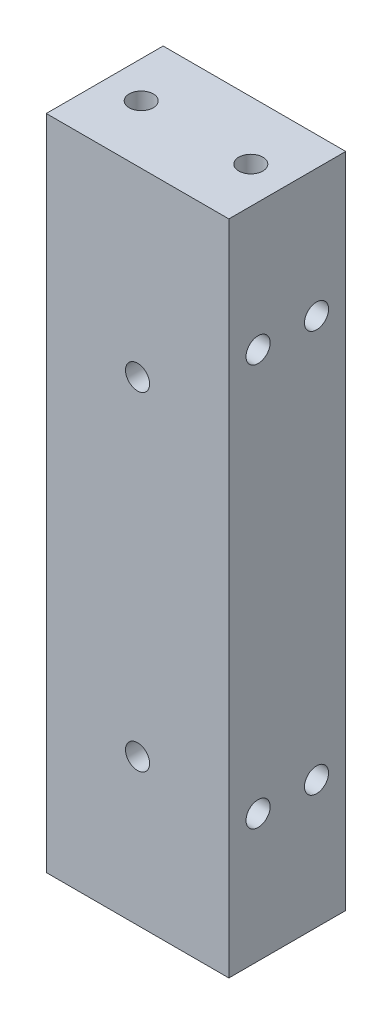
ISO-10303-21;
HEADER;
FILE_DESCRIPTION(('STEP AP214'),'2;1');
FILE_NAME('part.step','',(''),(''),'','','');
FILE_SCHEMA(('AUTOMOTIVE_DESIGN { 1 0 10303 214 1 1 1 1 }'));
ENDSEC;
DATA;
#1=APPLICATION_CONTEXT('core data for automotive mechanical design processes');
#2=APPLICATION_PROTOCOL_DEFINITION('international standard','automotive_design',2000,#1);
#3=PRODUCT_CONTEXT('',#1,'mechanical');
#4=PRODUCT('Part','Part','',(#3));
#5=PRODUCT_RELATED_PRODUCT_CATEGORY('part','',(#4));
#6=PRODUCT_DEFINITION_FORMATION('','',#4);
#7=PRODUCT_DEFINITION_CONTEXT('part definition',#1,'design');
#8=PRODUCT_DEFINITION('design','',#6,#7);
#9=PRODUCT_DEFINITION_SHAPE('','',#8);
#10=(LENGTH_UNIT() NAMED_UNIT(*) SI_UNIT(.MILLI.,.METRE.));
#11=(NAMED_UNIT(*) PLANE_ANGLE_UNIT() SI_UNIT($,.RADIAN.));
#12=(NAMED_UNIT(*) SI_UNIT($,.STERADIAN.) SOLID_ANGLE_UNIT());
#13=UNCERTAINTY_MEASURE_WITH_UNIT(LENGTH_MEASURE(1.E-05),#10,'distance_accuracy_value','');
#14=(GEOMETRIC_REPRESENTATION_CONTEXT(3) GLOBAL_UNCERTAINTY_ASSIGNED_CONTEXT((#13)) GLOBAL_UNIT_ASSIGNED_CONTEXT((#10,
#11,#12)) REPRESENTATION_CONTEXT('',''));
#15=CARTESIAN_POINT('',(0.,0.,0.));
#16=DIRECTION('',(0.,0.,1.));
#17=DIRECTION('',(1.,0.,0.));
#18=AXIS2_PLACEMENT_3D('',#15,#16,#17);
#19=CARTESIAN_POINT('',(12.5,90.,8.));
#20=DIRECTION('',(-1.,0.,0.));
#21=DIRECTION('',(0.,0.,1.));
#22=AXIS2_PLACEMENT_3D('',#19,#20,#21);
#23=PLANE('',#22);
#24=CARTESIAN_POINT('',(12.5,72.5,-4.));
#25=DIRECTION('',(1.,0.,0.));
#26=DIRECTION('',(0.,0.,-1.));
#27=AXIS2_PLACEMENT_3D('',#24,#25,#26);
#28=CIRCLE('',#27,1.64999999999998);
#29=CARTESIAN_POINT('',(12.5,72.5,-5.64999999999999));
#30=VERTEX_POINT('',#29);
#31=EDGE_CURVE('E142',#30,#30,#28,.T.);
#32=ORIENTED_EDGE('',*,*,#31,.F.);
#33=EDGE_LOOP('',(#32));
#34=FACE_BOUND('',#33,.T.);
#35=CARTESIAN_POINT('',(12.5,72.5,4.));
#36=DIRECTION('',(1.,0.,0.));
#37=DIRECTION('',(0.,0.,-1.));
#38=AXIS2_PLACEMENT_3D('',#35,#36,#37);
#39=CIRCLE('',#38,1.64999999999998);
#40=CARTESIAN_POINT('',(12.5,72.5,2.35000000000001));
#41=VERTEX_POINT('',#40);
#42=EDGE_CURVE('E141',#41,#41,#39,.T.);
#43=ORIENTED_EDGE('',*,*,#42,.F.);
#44=EDGE_LOOP('',(#43));
#45=FACE_BOUND('',#44,.T.);
#46=CARTESIAN_POINT('',(12.5,17.5,-4.));
#47=DIRECTION('',(1.,0.,0.));
#48=DIRECTION('',(0.,0.,-1.));
#49=AXIS2_PLACEMENT_3D('',#46,#47,#48);
#50=CIRCLE('',#49,1.64999999999999);
#51=CARTESIAN_POINT('',(12.5,17.5,-5.65));
#52=VERTEX_POINT('',#51);
#53=EDGE_CURVE('E155',#52,#52,#50,.T.);
#54=ORIENTED_EDGE('',*,*,#53,.F.);
#55=EDGE_LOOP('',(#54));
#56=FACE_BOUND('',#55,.T.);
#57=CARTESIAN_POINT('',(12.5,17.5,4.));
#58=DIRECTION('',(1.,0.,0.));
#59=DIRECTION('',(0.,0.,-1.));
#60=AXIS2_PLACEMENT_3D('',#57,#58,#59);
#61=CIRCLE('',#60,1.64999999999999);
#62=CARTESIAN_POINT('',(12.5,17.5,2.35));
#63=VERTEX_POINT('',#62);
#64=EDGE_CURVE('E163',#63,#63,#61,.T.);
#65=ORIENTED_EDGE('',*,*,#64,.F.);
#66=EDGE_LOOP('',(#65));
#67=FACE_BOUND('',#66,.T.);
#68=DIRECTION('',(0.,0.,-1.));
#69=VECTOR('',#68,1.);
#70=CARTESIAN_POINT('',(12.5,0.,8.));
#71=LINE('',#70,#69);
#72=CARTESIAN_POINT('',(12.5,0.,8.));
#73=VERTEX_POINT('',#72);
#74=CARTESIAN_POINT('',(12.5,0.,-8.));
#75=VERTEX_POINT('',#74);
#76=EDGE_CURVE('E251',#73,#75,#71,.T.);
#77=ORIENTED_EDGE('',*,*,#76,.T.);
#78=DIRECTION('',(0.,-1.,0.));
#79=VECTOR('',#78,1.);
#80=CARTESIAN_POINT('',(12.5,90.,-8.));
#81=LINE('',#80,#79);
#82=CARTESIAN_POINT('',(12.5,90.,-8.));
#83=VERTEX_POINT('',#82);
#84=EDGE_CURVE('E11',#83,#75,#81,.T.);
#85=ORIENTED_EDGE('',*,*,#84,.F.);
#86=DIRECTION('',(0.,0.,-1.));
#87=VECTOR('',#86,1.);
#88=CARTESIAN_POINT('',(12.5,90.,8.));
#89=LINE('',#88,#87);
#90=CARTESIAN_POINT('',(12.5,90.,8.));
#91=VERTEX_POINT('',#90);
#92=EDGE_CURVE('E252',#91,#83,#89,.T.);
#93=ORIENTED_EDGE('',*,*,#92,.F.);
#94=DIRECTION('',(0.,-1.,0.));
#95=VECTOR('',#94,1.);
#96=CARTESIAN_POINT('',(12.5,90.,8.));
#97=LINE('',#96,#95);
#98=EDGE_CURVE('E262',#91,#73,#97,.T.);
#99=ORIENTED_EDGE('',*,*,#98,.T.);
#100=EDGE_LOOP('',(#77,#85,#93,#99));
#101=FACE_BOUND('',#100,.T.);
#102=ADVANCED_FACE('F45',(#34,#45,#56,#67,#101),#23,.F.);
#103=CARTESIAN_POINT('',(-12.5,90.,-8.));
#104=DIRECTION('',(0.,0.,1.));
#105=DIRECTION('',(1.,0.,0.));
#106=AXIS2_PLACEMENT_3D('',#103,#104,#105);
#107=PLANE('',#106);
#108=CARTESIAN_POINT('',(0.,20.,-8.));
#109=DIRECTION('',(0.,0.,-1.));
#110=DIRECTION('',(-1.,0.,0.));
#111=AXIS2_PLACEMENT_3D('',#108,#109,#110);
#112=CIRCLE('',#111,1.64999999999999);
#113=CARTESIAN_POINT('',(-1.64999999999999,20.,-8.));
#114=VERTEX_POINT('',#113);
#115=EDGE_CURVE('E203',#114,#114,#112,.T.);
#116=ORIENTED_EDGE('',*,*,#115,.F.);
#117=EDGE_LOOP('',(#116));
#118=FACE_BOUND('',#117,.T.);
#119=CARTESIAN_POINT('',(1.54390389361936E-13,65.,-8.));
#120=DIRECTION('',(0.,0.,-1.));
#121=DIRECTION('',(-1.,0.,0.));
#122=AXIS2_PLACEMENT_3D('',#119,#120,#121);
#123=CIRCLE('',#122,1.64999999999999);
#124=CARTESIAN_POINT('',(-1.64999999999983,65.,-8.));
#125=VERTEX_POINT('',#124);
#126=EDGE_CURVE('E211',#125,#125,#123,.T.);
#127=ORIENTED_EDGE('',*,*,#126,.F.);
#128=EDGE_LOOP('',(#127));
#129=FACE_BOUND('',#128,.T.);
#130=DIRECTION('',(-1.,0.,0.));
#131=VECTOR('',#130,1.);
#132=CARTESIAN_POINT('',(-12.5,0.,-8.));
#133=LINE('',#132,#131);
#134=CARTESIAN_POINT('',(-12.5,0.,-8.));
#135=VERTEX_POINT('',#134);
#136=EDGE_CURVE('E266',#75,#135,#133,.T.);
#137=ORIENTED_EDGE('',*,*,#136,.T.);
#138=DIRECTION('',(0.,-1.,0.));
#139=VECTOR('',#138,1.);
#140=CARTESIAN_POINT('',(-12.5,90.,-8.));
#141=LINE('',#140,#139);
#142=CARTESIAN_POINT('',(-12.5,90.,-8.));
#143=VERTEX_POINT('',#142);
#144=EDGE_CURVE('E54',#143,#135,#141,.T.);
#145=ORIENTED_EDGE('',*,*,#144,.F.);
#146=DIRECTION('',(-1.,0.,0.));
#147=VECTOR('',#146,1.);
#148=CARTESIAN_POINT('',(-12.5,90.,-8.));
#149=LINE('',#148,#147);
#150=EDGE_CURVE('E93',#83,#143,#149,.T.);
#151=ORIENTED_EDGE('',*,*,#150,.F.);
#152=ORIENTED_EDGE('',*,*,#84,.T.);
#153=EDGE_LOOP('',(#137,#145,#151,#152));
#154=FACE_BOUND('',#153,.T.);
#155=ADVANCED_FACE('F297',(#118,#129,#154),#107,.F.);
#156=CARTESIAN_POINT('',(-12.5,90.,8.));
#157=DIRECTION('',(1.,0.,0.));
#158=DIRECTION('',(0.,0.,-1.));
#159=AXIS2_PLACEMENT_3D('',#156,#157,#158);
#160=PLANE('',#159);
#161=CARTESIAN_POINT('',(-12.5,72.5,-4.));
#162=DIRECTION('',(-1.,0.,0.));
#163=DIRECTION('',(0.,0.,1.));
#164=AXIS2_PLACEMENT_3D('',#161,#162,#163);
#165=CIRCLE('',#164,1.64999999999998);
#166=CARTESIAN_POINT('',(-12.5,72.5,-2.35000000000002));
#167=VERTEX_POINT('',#166);
#168=EDGE_CURVE('E171',#167,#167,#165,.T.);
#169=ORIENTED_EDGE('',*,*,#168,.F.);
#170=EDGE_LOOP('',(#169));
#171=FACE_BOUND('',#170,.T.);
#172=CARTESIAN_POINT('',(-12.5,72.5,4.));
#173=DIRECTION('',(-1.,0.,0.));
#174=DIRECTION('',(0.,0.,1.));
#175=AXIS2_PLACEMENT_3D('',#172,#173,#174);
#176=CIRCLE('',#175,1.64999999999998);
#177=CARTESIAN_POINT('',(-12.5,72.5,5.64999999999998));
#178=VERTEX_POINT('',#177);
#179=EDGE_CURVE('E179',#178,#178,#176,.T.);
#180=ORIENTED_EDGE('',*,*,#179,.F.);
#181=EDGE_LOOP('',(#180));
#182=FACE_BOUND('',#181,.T.);
#183=CARTESIAN_POINT('',(-12.5,17.5,-4.));
#184=DIRECTION('',(-1.,0.,0.));
#185=DIRECTION('',(0.,0.,1.));
#186=AXIS2_PLACEMENT_3D('',#183,#184,#185);
#187=CIRCLE('',#186,1.64999999999999);
#188=CARTESIAN_POINT('',(-12.5,17.5,-2.35000000000001));
#189=VERTEX_POINT('',#188);
#190=EDGE_CURVE('E187',#189,#189,#187,.T.);
#191=ORIENTED_EDGE('',*,*,#190,.F.);
#192=EDGE_LOOP('',(#191));
#193=FACE_BOUND('',#192,.T.);
#194=CARTESIAN_POINT('',(-12.5,17.5,4.));
#195=DIRECTION('',(-1.,0.,0.));
#196=DIRECTION('',(0.,0.,1.));
#197=AXIS2_PLACEMENT_3D('',#194,#195,#196);
#198=CIRCLE('',#197,1.64999999999999);
#199=CARTESIAN_POINT('',(-12.5,17.5,5.64999999999999));
#200=VERTEX_POINT('',#199);
#201=EDGE_CURVE('E195',#200,#200,#198,.T.);
#202=ORIENTED_EDGE('',*,*,#201,.F.);
#203=EDGE_LOOP('',(#202));
#204=FACE_BOUND('',#203,.T.);
#205=DIRECTION('',(0.,0.,1.));
#206=VECTOR('',#205,1.);
#207=CARTESIAN_POINT('',(-12.5,0.,8.));
#208=LINE('',#207,#206);
#209=CARTESIAN_POINT('',(-12.5,0.,8.));
#210=VERTEX_POINT('',#209);
#211=EDGE_CURVE('E80',#135,#210,#208,.T.);
#212=ORIENTED_EDGE('',*,*,#211,.T.);
#213=DIRECTION('',(0.,-1.,0.));
#214=VECTOR('',#213,1.);
#215=CARTESIAN_POINT('',(-12.5,90.,8.));
#216=LINE('',#215,#214);
#217=CARTESIAN_POINT('',(-12.5,90.,8.));
#218=VERTEX_POINT('',#217);
#219=EDGE_CURVE('E275',#218,#210,#216,.T.);
#220=ORIENTED_EDGE('',*,*,#219,.F.);
#221=DIRECTION('',(0.,0.,1.));
#222=VECTOR('',#221,1.);
#223=CARTESIAN_POINT('',(-12.5,90.,8.));
#224=LINE('',#223,#222);
#225=EDGE_CURVE('E257',#143,#218,#224,.T.);
#226=ORIENTED_EDGE('',*,*,#225,.F.);
#227=ORIENTED_EDGE('',*,*,#144,.T.);
#228=EDGE_LOOP('',(#212,#220,#226,#227));
#229=FACE_BOUND('',#228,.T.);
#230=ADVANCED_FACE('F279',(#171,#182,#193,#204,#229),#160,.F.);
#231=CARTESIAN_POINT('',(-12.5,90.,8.));
#232=DIRECTION('',(0.,0.,-1.));
#233=DIRECTION('',(-1.,0.,0.));
#234=AXIS2_PLACEMENT_3D('',#231,#232,#233);
#235=PLANE('',#234);
#236=CARTESIAN_POINT('',(0.,20.,8.));
#237=DIRECTION('',(0.,0.,-1.));
#238=DIRECTION('',(-1.,0.,0.));
#239=AXIS2_PLACEMENT_3D('',#236,#237,#238);
#240=CIRCLE('',#239,1.65);
#241=CARTESIAN_POINT('',(-1.65,20.,8.));
#242=VERTEX_POINT('',#241);
#243=EDGE_CURVE('E207',#242,#242,#240,.T.);
#244=ORIENTED_EDGE('',*,*,#243,.T.);
#245=EDGE_LOOP('',(#244));
#246=FACE_BOUND('',#245,.T.);
#247=CARTESIAN_POINT('',(1.54390389361936E-13,65.,8.));
#248=DIRECTION('',(0.,0.,-1.));
#249=DIRECTION('',(-1.,0.,0.));
#250=AXIS2_PLACEMENT_3D('',#247,#248,#249);
#251=CIRCLE('',#250,1.65);
#252=CARTESIAN_POINT('',(-1.64999999999984,65.,8.));
#253=VERTEX_POINT('',#252);
#254=EDGE_CURVE('E215',#253,#253,#251,.T.);
#255=ORIENTED_EDGE('',*,*,#254,.T.);
#256=EDGE_LOOP('',(#255));
#257=FACE_BOUND('',#256,.T.);
#258=DIRECTION('',(1.,0.,0.));
#259=VECTOR('',#258,1.);
#260=CARTESIAN_POINT('',(-12.5,0.,8.));
#261=LINE('',#260,#259);
#262=EDGE_CURVE('E86',#210,#73,#261,.T.);
#263=ORIENTED_EDGE('',*,*,#262,.T.);
#264=ORIENTED_EDGE('',*,*,#98,.F.);
#265=DIRECTION('',(1.,0.,0.));
#266=VECTOR('',#265,1.);
#267=CARTESIAN_POINT('',(-12.5,90.,8.));
#268=LINE('',#267,#266);
#269=EDGE_CURVE('E62',#218,#91,#268,.T.);
#270=ORIENTED_EDGE('',*,*,#269,.F.);
#271=ORIENTED_EDGE('',*,*,#219,.T.);
#272=EDGE_LOOP('',(#263,#264,#270,#271));
#273=FACE_BOUND('',#272,.T.);
#274=ADVANCED_FACE('F286',(#246,#257,#273),#235,.F.);
#275=CARTESIAN_POINT('',(0.,90.,0.));
#276=DIRECTION('',(0.,-1.,0.));
#277=DIRECTION('',(0.,0.,-1.));
#278=AXIS2_PLACEMENT_3D('',#275,#276,#277);
#279=PLANE('',#278);
#280=CARTESIAN_POINT('',(-7.5,90.,0.));
#281=DIRECTION('',(0.,1.,0.));
#282=DIRECTION('',(0.,0.,1.));
#283=AXIS2_PLACEMENT_3D('',#280,#281,#282);
#284=CIRCLE('',#283,1.65);
#285=CARTESIAN_POINT('',(-7.5,90.,1.65));
#286=VERTEX_POINT('',#285);
#287=EDGE_CURVE('E235',#286,#286,#284,.T.);
#288=ORIENTED_EDGE('',*,*,#287,.F.);
#289=EDGE_LOOP('',(#288));
#290=FACE_BOUND('',#289,.T.);
#291=CARTESIAN_POINT('',(7.5,90.,0.));
#292=DIRECTION('',(0.,1.,0.));
#293=DIRECTION('',(0.,0.,1.));
#294=AXIS2_PLACEMENT_3D('',#291,#292,#293);
#295=CIRCLE('',#294,1.65);
#296=CARTESIAN_POINT('',(7.5,90.,1.65));
#297=VERTEX_POINT('',#296);
#298=EDGE_CURVE('E243',#297,#297,#295,.T.);
#299=ORIENTED_EDGE('',*,*,#298,.F.);
#300=EDGE_LOOP('',(#299));
#301=FACE_BOUND('',#300,.T.);
#302=ORIENTED_EDGE('',*,*,#92,.T.);
#303=ORIENTED_EDGE('',*,*,#150,.T.);
#304=ORIENTED_EDGE('',*,*,#225,.T.);
#305=ORIENTED_EDGE('',*,*,#269,.T.);
#306=EDGE_LOOP('',(#302,#303,#304,#305));
#307=FACE_BOUND('',#306,.T.);
#308=ADVANCED_FACE('F288',(#290,#301,#307),#279,.F.);
#309=CARTESIAN_POINT('',(0.,0.,0.));
#310=DIRECTION('',(0.,-1.,0.));
#311=DIRECTION('',(0.,0.,-1.));
#312=AXIS2_PLACEMENT_3D('',#309,#310,#311);
#313=PLANE('',#312);
#314=CARTESIAN_POINT('',(7.5,0.,0.));
#315=DIRECTION('',(0.,-1.,0.));
#316=DIRECTION('',(0.,0.,-1.));
#317=AXIS2_PLACEMENT_3D('',#314,#315,#316);
#318=CIRCLE('',#317,1.64999999999999);
#319=CARTESIAN_POINT('',(7.5,0.,-1.64999999999999));
#320=VERTEX_POINT('',#319);
#321=EDGE_CURVE('E219',#320,#320,#318,.T.);
#322=ORIENTED_EDGE('',*,*,#321,.F.);
#323=EDGE_LOOP('',(#322));
#324=FACE_BOUND('',#323,.T.);
#325=CARTESIAN_POINT('',(-7.5,0.,0.));
#326=DIRECTION('',(0.,-1.,0.));
#327=DIRECTION('',(0.,0.,-1.));
#328=AXIS2_PLACEMENT_3D('',#325,#326,#327);
#329=CIRCLE('',#328,1.64999999999999);
#330=CARTESIAN_POINT('',(-7.5,0.,-1.64999999999999));
#331=VERTEX_POINT('',#330);
#332=EDGE_CURVE('E227',#331,#331,#329,.T.);
#333=ORIENTED_EDGE('',*,*,#332,.F.);
#334=EDGE_LOOP('',(#333));
#335=FACE_BOUND('',#334,.T.);
#336=ORIENTED_EDGE('',*,*,#76,.F.);
#337=ORIENTED_EDGE('',*,*,#262,.F.);
#338=ORIENTED_EDGE('',*,*,#211,.F.);
#339=ORIENTED_EDGE('',*,*,#136,.F.);
#340=EDGE_LOOP('',(#336,#337,#338,#339));
#341=FACE_BOUND('',#340,.T.);
#342=ADVANCED_FACE('F282',(#324,#335,#341),#313,.T.);
#343=CARTESIAN_POINT('',(7.5,82.,0.));
#344=DIRECTION('',(0.,1.,0.));
#345=DIRECTION('',(0.,0.,1.));
#346=AXIS2_PLACEMENT_3D('',#343,#344,#345);
#347=CONICAL_SURFACE('',#346,1.65,1.02974425867666);
#348=CARTESIAN_POINT('',(7.5,81.0085799786045,0.));
#349=VERTEX_POINT('',#348);
#350=VERTEX_LOOP('',#349);
#351=FACE_BOUND('',#350,.T.);
#352=CARTESIAN_POINT('',(7.5,82.,0.));
#353=DIRECTION('',(0.,1.,0.));
#354=DIRECTION('',(0.,0.,1.));
#355=AXIS2_PLACEMENT_3D('',#352,#353,#354);
#356=CIRCLE('',#355,1.65);
#357=CARTESIAN_POINT('',(7.5,82.,1.64999999999999));
#358=VERTEX_POINT('',#357);
#359=EDGE_CURVE('E247',#358,#358,#356,.T.);
#360=ORIENTED_EDGE('',*,*,#359,.T.);
#361=EDGE_LOOP('',(#360));
#362=FACE_BOUND('',#361,.T.);
#363=ADVANCED_FACE('F401',(#351,#362),#347,.F.);
#364=CARTESIAN_POINT('',(7.5,90.,0.));
#365=DIRECTION('',(0.,1.,0.));
#366=DIRECTION('',(0.,0.,1.));
#367=AXIS2_PLACEMENT_3D('',#364,#365,#366);
#368=CYLINDRICAL_SURFACE('',#367,1.65);
#369=ORIENTED_EDGE('',*,*,#359,.F.);
#370=EDGE_LOOP('',(#369));
#371=FACE_BOUND('',#370,.T.);
#372=ORIENTED_EDGE('',*,*,#298,.T.);
#373=EDGE_LOOP('',(#372));
#374=FACE_BOUND('',#373,.T.);
#375=ADVANCED_FACE('F397',(#371,#374),#368,.F.);
#376=CARTESIAN_POINT('',(-7.5,82.,0.));
#377=DIRECTION('',(0.,1.,0.));
#378=DIRECTION('',(0.,0.,1.));
#379=AXIS2_PLACEMENT_3D('',#376,#377,#378);
#380=CONICAL_SURFACE('',#379,1.65,1.02974425867666);
#381=CARTESIAN_POINT('',(-7.5,81.0085799786045,0.));
#382=VERTEX_POINT('',#381);
#383=VERTEX_LOOP('',#382);
#384=FACE_BOUND('',#383,.T.);
#385=CARTESIAN_POINT('',(-7.5,82.,0.));
#386=DIRECTION('',(0.,1.,0.));
#387=DIRECTION('',(0.,0.,1.));
#388=AXIS2_PLACEMENT_3D('',#385,#386,#387);
#389=CIRCLE('',#388,1.65);
#390=CARTESIAN_POINT('',(-7.5,82.,1.65));
#391=VERTEX_POINT('',#390);
#392=EDGE_CURVE('E239',#391,#391,#389,.T.);
#393=ORIENTED_EDGE('',*,*,#392,.T.);
#394=EDGE_LOOP('',(#393));
#395=FACE_BOUND('',#394,.T.);
#396=ADVANCED_FACE('F393',(#384,#395),#380,.F.);
#397=CARTESIAN_POINT('',(-7.5,90.,0.));
#398=DIRECTION('',(0.,1.,0.));
#399=DIRECTION('',(0.,0.,1.));
#400=AXIS2_PLACEMENT_3D('',#397,#398,#399);
#401=CYLINDRICAL_SURFACE('',#400,1.65);
#402=ORIENTED_EDGE('',*,*,#392,.F.);
#403=EDGE_LOOP('',(#402));
#404=FACE_BOUND('',#403,.T.);
#405=ORIENTED_EDGE('',*,*,#287,.T.);
#406=EDGE_LOOP('',(#405));
#407=FACE_BOUND('',#406,.T.);
#408=ADVANCED_FACE('F389',(#404,#407),#401,.F.);
#409=CARTESIAN_POINT('',(-7.5,12.,0.));
#410=DIRECTION('',(0.,-1.,0.));
#411=DIRECTION('',(0.,0.,-1.));
#412=AXIS2_PLACEMENT_3D('',#409,#410,#411);
#413=CONICAL_SURFACE('',#412,1.65,1.02974425867665);
#414=CARTESIAN_POINT('',(-7.5,12.9914200213955,0.));
#415=VERTEX_POINT('',#414);
#416=VERTEX_LOOP('',#415);
#417=FACE_BOUND('',#416,.T.);
#418=CARTESIAN_POINT('',(-7.5,12.,0.));
#419=DIRECTION('',(0.,-1.,0.));
#420=DIRECTION('',(0.,0.,-1.));
#421=AXIS2_PLACEMENT_3D('',#418,#419,#420);
#422=CIRCLE('',#421,1.65);
#423=CARTESIAN_POINT('',(-7.5,12.,-1.65));
#424=VERTEX_POINT('',#423);
#425=EDGE_CURVE('E231',#424,#424,#422,.T.);
#426=ORIENTED_EDGE('',*,*,#425,.T.);
#427=EDGE_LOOP('',(#426));
#428=FACE_BOUND('',#427,.T.);
#429=ADVANCED_FACE('F385',(#417,#428),#413,.F.);
#430=CARTESIAN_POINT('',(-7.5,0.,0.));
#431=DIRECTION('',(0.,-1.,0.));
#432=DIRECTION('',(0.,0.,-1.));
#433=AXIS2_PLACEMENT_3D('',#430,#431,#432);
#434=CYLINDRICAL_SURFACE('',#433,1.64999999999999);
#435=ORIENTED_EDGE('',*,*,#425,.F.);
#436=EDGE_LOOP('',(#435));
#437=FACE_BOUND('',#436,.T.);
#438=ORIENTED_EDGE('',*,*,#332,.T.);
#439=EDGE_LOOP('',(#438));
#440=FACE_BOUND('',#439,.T.);
#441=ADVANCED_FACE('F381',(#437,#440),#434,.F.);
#442=CARTESIAN_POINT('',(7.5,12.,0.));
#443=DIRECTION('',(0.,-1.,0.));
#444=DIRECTION('',(0.,0.,-1.));
#445=AXIS2_PLACEMENT_3D('',#442,#443,#444);
#446=CONICAL_SURFACE('',#445,1.65,1.02974425867665);
#447=CARTESIAN_POINT('',(7.5,12.9914200213955,0.));
#448=VERTEX_POINT('',#447);
#449=VERTEX_LOOP('',#448);
#450=FACE_BOUND('',#449,.T.);
#451=CARTESIAN_POINT('',(7.5,12.,0.));
#452=DIRECTION('',(0.,-1.,0.));
#453=DIRECTION('',(0.,0.,-1.));
#454=AXIS2_PLACEMENT_3D('',#451,#452,#453);
#455=CIRCLE('',#454,1.65);
#456=CARTESIAN_POINT('',(7.5,12.,-1.65));
#457=VERTEX_POINT('',#456);
#458=EDGE_CURVE('E223',#457,#457,#455,.T.);
#459=ORIENTED_EDGE('',*,*,#458,.T.);
#460=EDGE_LOOP('',(#459));
#461=FACE_BOUND('',#460,.T.);
#462=ADVANCED_FACE('F377',(#450,#461),#446,.F.);
#463=CARTESIAN_POINT('',(7.5,0.,0.));
#464=DIRECTION('',(0.,-1.,0.));
#465=DIRECTION('',(0.,0.,-1.));
#466=AXIS2_PLACEMENT_3D('',#463,#464,#465);
#467=CYLINDRICAL_SURFACE('',#466,1.64999999999999);
#468=ORIENTED_EDGE('',*,*,#458,.F.);
#469=EDGE_LOOP('',(#468));
#470=FACE_BOUND('',#469,.T.);
#471=ORIENTED_EDGE('',*,*,#321,.T.);
#472=EDGE_LOOP('',(#471));
#473=FACE_BOUND('',#472,.T.);
#474=ADVANCED_FACE('F373',(#470,#473),#467,.F.);
#475=CARTESIAN_POINT('',(1.54390389361936E-13,65.,-8.));
#476=DIRECTION('',(0.,0.,-1.));
#477=DIRECTION('',(-1.,0.,0.));
#478=AXIS2_PLACEMENT_3D('',#475,#476,#477);
#479=CYLINDRICAL_SURFACE('',#478,1.64999999999999);
#480=ORIENTED_EDGE('',*,*,#254,.F.);
#481=EDGE_LOOP('',(#480));
#482=FACE_BOUND('',#481,.T.);
#483=ORIENTED_EDGE('',*,*,#126,.T.);
#484=EDGE_LOOP('',(#483));
#485=FACE_BOUND('',#484,.T.);
#486=ADVANCED_FACE('F369',(#482,#485),#479,.F.);
#487=CARTESIAN_POINT('',(0.,20.,-8.));
#488=DIRECTION('',(0.,0.,-1.));
#489=DIRECTION('',(-1.,0.,0.));
#490=AXIS2_PLACEMENT_3D('',#487,#488,#489);
#491=CYLINDRICAL_SURFACE('',#490,1.64999999999999);
#492=ORIENTED_EDGE('',*,*,#243,.F.);
#493=EDGE_LOOP('',(#492));
#494=FACE_BOUND('',#493,.T.);
#495=ORIENTED_EDGE('',*,*,#115,.T.);
#496=EDGE_LOOP('',(#495));
#497=FACE_BOUND('',#496,.T.);
#498=ADVANCED_FACE('F365',(#494,#497),#491,.F.);
#499=CARTESIAN_POINT('',(-4.5,17.5,4.));
#500=DIRECTION('',(-1.,0.,0.));
#501=DIRECTION('',(0.,0.,1.));
#502=AXIS2_PLACEMENT_3D('',#499,#500,#501);
#503=CONICAL_SURFACE('',#502,1.65,1.02974425867665);
#504=CARTESIAN_POINT('',(-3.50857997860453,17.5,4.));
#505=VERTEX_POINT('',#504);
#506=VERTEX_LOOP('',#505);
#507=FACE_BOUND('',#506,.T.);
#508=CARTESIAN_POINT('',(-4.5,17.5,4.));
#509=DIRECTION('',(-1.,0.,0.));
#510=DIRECTION('',(0.,0.,1.));
#511=AXIS2_PLACEMENT_3D('',#508,#509,#510);
#512=CIRCLE('',#511,1.65);
#513=CARTESIAN_POINT('',(-4.5,17.5,5.65));
#514=VERTEX_POINT('',#513);
#515=EDGE_CURVE('E199',#514,#514,#512,.T.);
#516=ORIENTED_EDGE('',*,*,#515,.T.);
#517=EDGE_LOOP('',(#516));
#518=FACE_BOUND('',#517,.T.);
#519=ADVANCED_FACE('F361',(#507,#518),#503,.F.);
#520=CARTESIAN_POINT('',(-12.5,17.5,4.));
#521=DIRECTION('',(-1.,0.,0.));
#522=DIRECTION('',(0.,0.,1.));
#523=AXIS2_PLACEMENT_3D('',#520,#521,#522);
#524=CYLINDRICAL_SURFACE('',#523,1.65);
#525=ORIENTED_EDGE('',*,*,#515,.F.);
#526=EDGE_LOOP('',(#525));
#527=FACE_BOUND('',#526,.T.);
#528=ORIENTED_EDGE('',*,*,#201,.T.);
#529=EDGE_LOOP('',(#528));
#530=FACE_BOUND('',#529,.T.);
#531=ADVANCED_FACE('F357',(#527,#530),#524,.F.);
#532=CARTESIAN_POINT('',(-4.5,17.5,-4.));
#533=DIRECTION('',(-1.,0.,0.));
#534=DIRECTION('',(0.,0.,1.));
#535=AXIS2_PLACEMENT_3D('',#532,#533,#534);
#536=CONICAL_SURFACE('',#535,1.65,1.02974425867665);
#537=CARTESIAN_POINT('',(-3.50857997860453,17.5,-4.));
#538=VERTEX_POINT('',#537);
#539=VERTEX_LOOP('',#538);
#540=FACE_BOUND('',#539,.T.);
#541=CARTESIAN_POINT('',(-4.5,17.5,-4.));
#542=DIRECTION('',(-1.,0.,0.));
#543=DIRECTION('',(0.,0.,1.));
#544=AXIS2_PLACEMENT_3D('',#541,#542,#543);
#545=CIRCLE('',#544,1.65);
#546=CARTESIAN_POINT('',(-4.5,17.5,-2.35));
#547=VERTEX_POINT('',#546);
#548=EDGE_CURVE('E191',#547,#547,#545,.T.);
#549=ORIENTED_EDGE('',*,*,#548,.T.);
#550=EDGE_LOOP('',(#549));
#551=FACE_BOUND('',#550,.T.);
#552=ADVANCED_FACE('F353',(#540,#551),#536,.F.);
#553=CARTESIAN_POINT('',(-12.5,17.5,-4.));
#554=DIRECTION('',(-1.,0.,0.));
#555=DIRECTION('',(0.,0.,1.));
#556=AXIS2_PLACEMENT_3D('',#553,#554,#555);
#557=CYLINDRICAL_SURFACE('',#556,1.65);
#558=ORIENTED_EDGE('',*,*,#548,.F.);
#559=EDGE_LOOP('',(#558));
#560=FACE_BOUND('',#559,.T.);
#561=ORIENTED_EDGE('',*,*,#190,.T.);
#562=EDGE_LOOP('',(#561));
#563=FACE_BOUND('',#562,.T.);
#564=ADVANCED_FACE('F349',(#560,#563),#557,.F.);
#565=CARTESIAN_POINT('',(-4.5,72.5,4.));
#566=DIRECTION('',(-1.,0.,0.));
#567=DIRECTION('',(0.,0.,1.));
#568=AXIS2_PLACEMENT_3D('',#565,#566,#567);
#569=CONICAL_SURFACE('',#568,1.65,1.02974425867665);
#570=CARTESIAN_POINT('',(-3.50857997860453,72.5,4.));
#571=VERTEX_POINT('',#570);
#572=VERTEX_LOOP('',#571);
#573=FACE_BOUND('',#572,.T.);
#574=CARTESIAN_POINT('',(-4.5,72.5,4.));
#575=DIRECTION('',(-1.,0.,0.));
#576=DIRECTION('',(0.,0.,1.));
#577=AXIS2_PLACEMENT_3D('',#574,#575,#576);
#578=CIRCLE('',#577,1.65);
#579=CARTESIAN_POINT('',(-4.5,72.5,5.65));
#580=VERTEX_POINT('',#579);
#581=EDGE_CURVE('E183',#580,#580,#578,.T.);
#582=ORIENTED_EDGE('',*,*,#581,.T.);
#583=EDGE_LOOP('',(#582));
#584=FACE_BOUND('',#583,.T.);
#585=ADVANCED_FACE('F345',(#573,#584),#569,.F.);
#586=CARTESIAN_POINT('',(-12.5,72.5,4.));
#587=DIRECTION('',(-1.,0.,0.));
#588=DIRECTION('',(0.,0.,1.));
#589=AXIS2_PLACEMENT_3D('',#586,#587,#588);
#590=CYLINDRICAL_SURFACE('',#589,1.64999999999999);
#591=ORIENTED_EDGE('',*,*,#581,.F.);
#592=EDGE_LOOP('',(#591));
#593=FACE_BOUND('',#592,.T.);
#594=ORIENTED_EDGE('',*,*,#179,.T.);
#595=EDGE_LOOP('',(#594));
#596=FACE_BOUND('',#595,.T.);
#597=ADVANCED_FACE('F341',(#593,#596),#590,.F.);
#598=CARTESIAN_POINT('',(-4.5,72.5,-4.));
#599=DIRECTION('',(-1.,0.,0.));
#600=DIRECTION('',(0.,0.,1.));
#601=AXIS2_PLACEMENT_3D('',#598,#599,#600);
#602=CONICAL_SURFACE('',#601,1.65,1.02974425867665);
#603=CARTESIAN_POINT('',(-3.50857997860453,72.5,-4.));
#604=VERTEX_POINT('',#603);
#605=VERTEX_LOOP('',#604);
#606=FACE_BOUND('',#605,.T.);
#607=CARTESIAN_POINT('',(-4.5,72.5,-4.));
#608=DIRECTION('',(-1.,0.,0.));
#609=DIRECTION('',(0.,0.,1.));
#610=AXIS2_PLACEMENT_3D('',#607,#608,#609);
#611=CIRCLE('',#610,1.65);
#612=CARTESIAN_POINT('',(-4.5,72.5,-2.35));
#613=VERTEX_POINT('',#612);
#614=EDGE_CURVE('E175',#613,#613,#611,.T.);
#615=ORIENTED_EDGE('',*,*,#614,.T.);
#616=EDGE_LOOP('',(#615));
#617=FACE_BOUND('',#616,.T.);
#618=ADVANCED_FACE('F337',(#606,#617),#602,.F.);
#619=CARTESIAN_POINT('',(-12.5,72.5,-4.));
#620=DIRECTION('',(-1.,0.,0.));
#621=DIRECTION('',(0.,0.,1.));
#622=AXIS2_PLACEMENT_3D('',#619,#620,#621);
#623=CYLINDRICAL_SURFACE('',#622,1.64999999999999);
#624=ORIENTED_EDGE('',*,*,#614,.F.);
#625=EDGE_LOOP('',(#624));
#626=FACE_BOUND('',#625,.T.);
#627=ORIENTED_EDGE('',*,*,#168,.T.);
#628=EDGE_LOOP('',(#627));
#629=FACE_BOUND('',#628,.T.);
#630=ADVANCED_FACE('F329',(#626,#629),#623,.F.);
#631=CARTESIAN_POINT('',(4.5,17.5,4.));
#632=DIRECTION('',(1.,0.,0.));
#633=DIRECTION('',(0.,0.,-1.));
#634=AXIS2_PLACEMENT_3D('',#631,#632,#633);
#635=CONICAL_SURFACE('',#634,1.65,1.02974425867665);
#636=CARTESIAN_POINT('',(3.50857997860453,17.5,4.));
#637=VERTEX_POINT('',#636);
#638=VERTEX_LOOP('',#637);
#639=FACE_BOUND('',#638,.T.);
#640=CARTESIAN_POINT('',(4.5,17.5,4.));
#641=DIRECTION('',(1.,0.,0.));
#642=DIRECTION('',(0.,0.,-1.));
#643=AXIS2_PLACEMENT_3D('',#640,#641,#642);
#644=CIRCLE('',#643,1.65);
#645=CARTESIAN_POINT('',(4.5,17.5,2.35));
#646=VERTEX_POINT('',#645);
#647=EDGE_CURVE('E167',#646,#646,#644,.T.);
#648=ORIENTED_EDGE('',*,*,#647,.T.);
#649=EDGE_LOOP('',(#648));
#650=FACE_BOUND('',#649,.T.);
#651=ADVANCED_FACE('F319',(#639,#650),#635,.F.);
#652=CARTESIAN_POINT('',(12.5,17.5,4.));
#653=DIRECTION('',(1.,0.,0.));
#654=DIRECTION('',(0.,0.,-1.));
#655=AXIS2_PLACEMENT_3D('',#652,#653,#654);
#656=CYLINDRICAL_SURFACE('',#655,1.65);
#657=ORIENTED_EDGE('',*,*,#647,.F.);
#658=EDGE_LOOP('',(#657));
#659=FACE_BOUND('',#658,.T.);
#660=ORIENTED_EDGE('',*,*,#64,.T.);
#661=EDGE_LOOP('',(#660));
#662=FACE_BOUND('',#661,.T.);
#663=ADVANCED_FACE('F316',(#659,#662),#656,.F.);
#664=CARTESIAN_POINT('',(4.5,17.5,-4.));
#665=DIRECTION('',(1.,0.,0.));
#666=DIRECTION('',(0.,0.,-1.));
#667=AXIS2_PLACEMENT_3D('',#664,#665,#666);
#668=CONICAL_SURFACE('',#667,1.65,1.02974425867665);
#669=CARTESIAN_POINT('',(3.50857997860453,17.5,-4.));
#670=VERTEX_POINT('',#669);
#671=VERTEX_LOOP('',#670);
#672=FACE_BOUND('',#671,.T.);
#673=CARTESIAN_POINT('',(4.5,17.5,-4.));
#674=DIRECTION('',(1.,0.,0.));
#675=DIRECTION('',(0.,0.,-1.));
#676=AXIS2_PLACEMENT_3D('',#673,#674,#675);
#677=CIRCLE('',#676,1.65);
#678=CARTESIAN_POINT('',(4.5,17.5,-5.65));
#679=VERTEX_POINT('',#678);
#680=EDGE_CURVE('E159',#679,#679,#677,.T.);
#681=ORIENTED_EDGE('',*,*,#680,.T.);
#682=EDGE_LOOP('',(#681));
#683=FACE_BOUND('',#682,.T.);
#684=ADVANCED_FACE('F318',(#672,#683),#668,.F.);
#685=CARTESIAN_POINT('',(12.5,17.5,-4.));
#686=DIRECTION('',(1.,0.,0.));
#687=DIRECTION('',(0.,0.,-1.));
#688=AXIS2_PLACEMENT_3D('',#685,#686,#687);
#689=CYLINDRICAL_SURFACE('',#688,1.65);
#690=ORIENTED_EDGE('',*,*,#680,.F.);
#691=EDGE_LOOP('',(#690));
#692=FACE_BOUND('',#691,.T.);
#693=ORIENTED_EDGE('',*,*,#53,.T.);
#694=EDGE_LOOP('',(#693));
#695=FACE_BOUND('',#694,.T.);
#696=ADVANCED_FACE('F326',(#692,#695),#689,.F.);
#697=CARTESIAN_POINT('',(4.5,72.5,4.));
#698=DIRECTION('',(1.,0.,0.));
#699=DIRECTION('',(0.,0.,-1.));
#700=AXIS2_PLACEMENT_3D('',#697,#698,#699);
#701=CONICAL_SURFACE('',#700,1.65,1.02974425867665);
#702=CARTESIAN_POINT('',(3.50857997860453,72.5,4.));
#703=VERTEX_POINT('',#702);
#704=VERTEX_LOOP('',#703);
#705=FACE_BOUND('',#704,.T.);
#706=CARTESIAN_POINT('',(4.5,72.5,4.));
#707=DIRECTION('',(1.,0.,0.));
#708=DIRECTION('',(0.,0.,-1.));
#709=AXIS2_PLACEMENT_3D('',#706,#707,#708);
#710=CIRCLE('',#709,1.65);
#711=CARTESIAN_POINT('',(4.5,72.5,2.35));
#712=VERTEX_POINT('',#711);
#713=EDGE_CURVE('E147',#712,#712,#710,.T.);
#714=ORIENTED_EDGE('',*,*,#713,.T.);
#715=EDGE_LOOP('',(#714));
#716=FACE_BOUND('',#715,.T.);
#717=ADVANCED_FACE('F536',(#705,#716),#701,.F.);
#718=CARTESIAN_POINT('',(12.5,72.5,4.));
#719=DIRECTION('',(1.,0.,0.));
#720=DIRECTION('',(0.,0.,-1.));
#721=AXIS2_PLACEMENT_3D('',#718,#719,#720);
#722=CYLINDRICAL_SURFACE('',#721,1.64999999999999);
#723=ORIENTED_EDGE('',*,*,#713,.F.);
#724=EDGE_LOOP('',(#723));
#725=FACE_BOUND('',#724,.T.);
#726=ORIENTED_EDGE('',*,*,#42,.T.);
#727=EDGE_LOOP('',(#726));
#728=FACE_BOUND('',#727,.T.);
#729=ADVANCED_FACE('F134',(#725,#728),#722,.F.);
#730=CARTESIAN_POINT('',(4.5,72.5,-4.));
#731=DIRECTION('',(1.,0.,0.));
#732=DIRECTION('',(0.,0.,-1.));
#733=AXIS2_PLACEMENT_3D('',#730,#731,#732);
#734=CONICAL_SURFACE('',#733,1.65,1.02974425867665);
#735=CARTESIAN_POINT('',(3.50857997860453,72.5,-4.));
#736=VERTEX_POINT('',#735);
#737=VERTEX_LOOP('',#736);
#738=FACE_BOUND('',#737,.T.);
#739=CARTESIAN_POINT('',(4.5,72.5,-4.));
#740=DIRECTION('',(1.,0.,0.));
#741=DIRECTION('',(0.,0.,-1.));
#742=AXIS2_PLACEMENT_3D('',#739,#740,#741);
#743=CIRCLE('',#742,1.65);
#744=CARTESIAN_POINT('',(4.5,72.5,-5.65));
#745=VERTEX_POINT('',#744);
#746=EDGE_CURVE('E138',#745,#745,#743,.T.);
#747=ORIENTED_EDGE('',*,*,#746,.T.);
#748=EDGE_LOOP('',(#747));
#749=FACE_BOUND('',#748,.T.);
#750=ADVANCED_FACE('F130',(#738,#749),#734,.F.);
#751=CARTESIAN_POINT('',(12.5,72.5,-4.));
#752=DIRECTION('',(1.,0.,0.));
#753=DIRECTION('',(0.,0.,-1.));
#754=AXIS2_PLACEMENT_3D('',#751,#752,#753);
#755=CYLINDRICAL_SURFACE('',#754,1.64999999999999);
#756=ORIENTED_EDGE('',*,*,#746,.F.);
#757=EDGE_LOOP('',(#756));
#758=FACE_BOUND('',#757,.T.);
#759=ORIENTED_EDGE('',*,*,#31,.T.);
#760=EDGE_LOOP('',(#759));
#761=FACE_BOUND('',#760,.T.);
#762=ADVANCED_FACE('F133',(#758,#761),#755,.F.);
#763=CLOSED_SHELL('',(#102,#155,#230,#274,#308,#342,#363,#375,#396,#408,#429,#441,#462,#474,
#486,#498,#519,#531,#552,#564,#585,#597,#618,#630,#651,#663,#684,#696,#717,#729,#750,#762));
#764=MANIFOLD_SOLID_BREP('B2',#763);
#765=ADVANCED_BREP_SHAPE_REPRESENTATION('',(#18,#764),#14);
#766=SHAPE_DEFINITION_REPRESENTATION(#9,#765);
ENDSEC;
END-ISO-10303-21;
